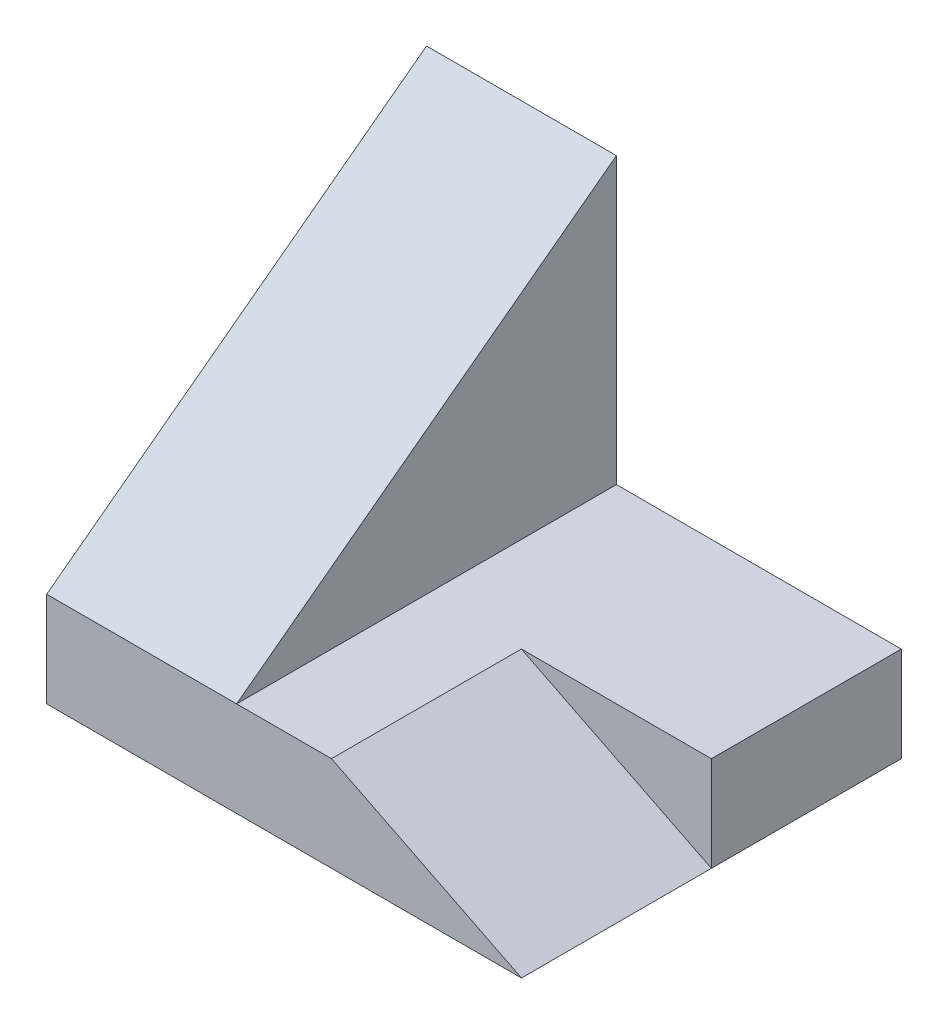
ISO-10303-21;
HEADER;
FILE_DESCRIPTION(('STEP AP214'),'2;1');
FILE_NAME('part.step','',(''),(''),'','','');
FILE_SCHEMA(('AUTOMOTIVE_DESIGN { 1 0 10303 214 1 1 1 1 }'));
ENDSEC;
DATA;
#1=APPLICATION_CONTEXT('core data for automotive mechanical design processes');
#2=APPLICATION_PROTOCOL_DEFINITION('international standard','automotive_design',2000,#1);
#3=PRODUCT_CONTEXT('',#1,'mechanical');
#4=PRODUCT('Part','Part','',(#3));
#5=PRODUCT_RELATED_PRODUCT_CATEGORY('part','',(#4));
#6=PRODUCT_DEFINITION_FORMATION('','',#4);
#7=PRODUCT_DEFINITION_CONTEXT('part definition',#1,'design');
#8=PRODUCT_DEFINITION('design','',#6,#7);
#9=PRODUCT_DEFINITION_SHAPE('','',#8);
#10=(LENGTH_UNIT() NAMED_UNIT(*) SI_UNIT(.MILLI.,.METRE.));
#11=(NAMED_UNIT(*) PLANE_ANGLE_UNIT() SI_UNIT($,.RADIAN.));
#12=(NAMED_UNIT(*) SI_UNIT($,.STERADIAN.) SOLID_ANGLE_UNIT());
#13=UNCERTAINTY_MEASURE_WITH_UNIT(LENGTH_MEASURE(1.E-05),#10,'distance_accuracy_value','');
#14=(GEOMETRIC_REPRESENTATION_CONTEXT(3) GLOBAL_UNCERTAINTY_ASSIGNED_CONTEXT((#13)) GLOBAL_UNIT_ASSIGNED_CONTEXT((#10,
#11,#12)) REPRESENTATION_CONTEXT('',''));
#15=CARTESIAN_POINT('',(0.,0.,0.));
#16=DIRECTION('',(0.,0.,1.));
#17=DIRECTION('',(1.,0.,0.));
#18=AXIS2_PLACEMENT_3D('',#15,#16,#17);
#19=CARTESIAN_POINT('',(0.,9.99999999999991,0.));
#20=DIRECTION('',(0.,-1.,0.));
#21=DIRECTION('',(0.,0.,-1.));
#22=AXIS2_PLACEMENT_3D('',#19,#20,#21);
#23=PLANE('',#22);
#24=DIRECTION('',(0.,0.,-1.));
#25=VECTOR('',#24,1.);
#26=CARTESIAN_POINT('',(20.0003346422784,9.99999999999991,0.));
#27=LINE('',#26,#25);
#28=CARTESIAN_POINT('',(20.0003346422784,9.99999999999991,0.));
#29=VERTEX_POINT('',#28);
#30=CARTESIAN_POINT('',(20.0003346422784,9.99999999999991,-40.));
#31=VERTEX_POINT('',#30);
#32=EDGE_CURVE('E145',#29,#31,#27,.T.);
#33=ORIENTED_EDGE('',*,*,#32,.F.);
#34=DIRECTION('',(1.,0.,0.));
#35=VECTOR('',#34,1.);
#36=CARTESIAN_POINT('',(0.,9.99999999999991,0.));
#37=LINE('',#36,#35);
#38=CARTESIAN_POINT('',(29.992004992005,9.99999999999991,0.));
#39=VERTEX_POINT('',#38);
#40=EDGE_CURVE('E97',#29,#39,#37,.T.);
#41=ORIENTED_EDGE('',*,*,#40,.T.);
#42=DIRECTION('',(0.,0.,1.));
#43=VECTOR('',#42,1.);
#44=CARTESIAN_POINT('',(29.992004992005,9.99999999999991,-19.9999999999999));
#45=LINE('',#44,#43);
#46=CARTESIAN_POINT('',(29.992004992005,9.99999999999991,-19.9999999999999));
#47=VERTEX_POINT('',#46);
#48=EDGE_CURVE('E112',#47,#39,#45,.T.);
#49=ORIENTED_EDGE('',*,*,#48,.F.);
#50=DIRECTION('',(-1.,0.,0.));
#51=VECTOR('',#50,1.);
#52=CARTESIAN_POINT('',(50.,9.99999999999991,-19.9999999999999));
#53=LINE('',#52,#51);
#54=CARTESIAN_POINT('',(50.,9.99999999999991,-19.9999999999999));
#55=VERTEX_POINT('',#54);
#56=EDGE_CURVE('E133',#55,#47,#53,.T.);
#57=ORIENTED_EDGE('',*,*,#56,.F.);
#58=DIRECTION('',(0.,0.,-1.));
#59=VECTOR('',#58,1.);
#60=CARTESIAN_POINT('',(50.,9.99999999999991,0.));
#61=LINE('',#60,#59);
#62=CARTESIAN_POINT('',(50.,9.99999999999991,-40.));
#63=VERTEX_POINT('',#62);
#64=EDGE_CURVE('E55',#55,#63,#61,.T.);
#65=ORIENTED_EDGE('',*,*,#64,.T.);
#66=DIRECTION('',(-1.,0.,0.));
#67=VECTOR('',#66,1.);
#68=CARTESIAN_POINT('',(0.,9.99999999999991,-40.));
#69=LINE('',#68,#67);
#70=EDGE_CURVE('E90',#63,#31,#69,.T.);
#71=ORIENTED_EDGE('',*,*,#70,.T.);
#72=EDGE_LOOP('',(#33,#41,#49,#57,#65,#71));
#73=FACE_BOUND('',#72,.T.);
#74=ADVANCED_FACE('F39',(#73),#23,.F.);
#75=CARTESIAN_POINT('',(50.,9.99999999999991,0.));
#76=DIRECTION('',(-1.,0.,0.));
#77=DIRECTION('',(0.,0.,1.));
#78=AXIS2_PLACEMENT_3D('',#75,#76,#77);
#79=PLANE('',#78);
#80=DIRECTION('',(0.,1.,0.));
#81=VECTOR('',#80,1.);
#82=CARTESIAN_POINT('',(50.,0.,-19.9999999999999));
#83=LINE('',#82,#81);
#84=CARTESIAN_POINT('',(50.,0.,-19.9999999999999));
#85=VERTEX_POINT('',#84);
#86=EDGE_CURVE('E77',#85,#55,#83,.T.);
#87=ORIENTED_EDGE('',*,*,#86,.F.);
#88=DIRECTION('',(0.,0.,-1.));
#89=VECTOR('',#88,1.);
#90=CARTESIAN_POINT('',(50.,0.,0.));
#91=LINE('',#90,#89);
#92=CARTESIAN_POINT('',(50.,0.,-40.));
#93=VERTEX_POINT('',#92);
#94=EDGE_CURVE('E72',#85,#93,#91,.T.);
#95=ORIENTED_EDGE('',*,*,#94,.T.);
#96=DIRECTION('',(0.,-1.,0.));
#97=VECTOR('',#96,1.);
#98=CARTESIAN_POINT('',(50.,9.99999999999991,-40.));
#99=LINE('',#98,#97);
#100=EDGE_CURVE('E48',#63,#93,#99,.T.);
#101=ORIENTED_EDGE('',*,*,#100,.F.);
#102=ORIENTED_EDGE('',*,*,#64,.F.);
#103=EDGE_LOOP('',(#87,#95,#101,#102));
#104=FACE_BOUND('',#103,.T.);
#105=ADVANCED_FACE('F74',(#104),#79,.F.);
#106=CARTESIAN_POINT('',(0.,9.99999999999991,0.));
#107=DIRECTION('',(1.,0.,0.));
#108=DIRECTION('',(0.,0.,-1.));
#109=AXIS2_PLACEMENT_3D('',#106,#107,#108);
#110=PLANE('',#109);
#111=DIRECTION('',(0.,-1.,0.));
#112=VECTOR('',#111,1.);
#113=CARTESIAN_POINT('',(0.,9.99999999999991,0.));
#114=LINE('',#113,#112);
#115=CARTESIAN_POINT('',(0.,9.99999999999991,0.));
#116=VERTEX_POINT('',#115);
#117=CARTESIAN_POINT('',(0.,0.,0.));
#118=VERTEX_POINT('',#117);
#119=EDGE_CURVE('E11',#116,#118,#114,.T.);
#120=ORIENTED_EDGE('',*,*,#119,.F.);
#121=DIRECTION('',(0.,0.599999999999999,-0.800000000000001));
#122=VECTOR('',#121,1.);
#123=CARTESIAN_POINT('',(0.,9.99999999999991,0.));
#124=LINE('',#123,#122);
#125=CARTESIAN_POINT('',(0.,39.9999999999998,-40.));
#126=VERTEX_POINT('',#125);
#127=EDGE_CURVE('E148',#116,#126,#124,.T.);
#128=ORIENTED_EDGE('',*,*,#127,.T.);
#129=DIRECTION('',(0.,-1.,0.));
#130=VECTOR('',#129,1.);
#131=CARTESIAN_POINT('',(0.,9.99999999999991,-40.));
#132=LINE('',#131,#130);
#133=CARTESIAN_POINT('',(0.,0.,-40.));
#134=VERTEX_POINT('',#133);
#135=EDGE_CURVE('E91',#126,#134,#132,.T.);
#136=ORIENTED_EDGE('',*,*,#135,.T.);
#137=DIRECTION('',(0.,0.,1.));
#138=VECTOR('',#137,1.);
#139=CARTESIAN_POINT('',(0.,0.,0.));
#140=LINE('',#139,#138);
#141=EDGE_CURVE('E96',#134,#118,#140,.T.);
#142=ORIENTED_EDGE('',*,*,#141,.T.);
#143=EDGE_LOOP('',(#120,#128,#136,#142));
#144=FACE_BOUND('',#143,.T.);
#145=ADVANCED_FACE('F41',(#144),#110,.F.);
#146=CARTESIAN_POINT('',(0.,9.99999999999991,0.));
#147=DIRECTION('',(0.,0.,-1.));
#148=DIRECTION('',(-1.,0.,0.));
#149=AXIS2_PLACEMENT_3D('',#146,#147,#148);
#150=PLANE('',#149);
#151=ORIENTED_EDGE('',*,*,#40,.F.);
#152=DIRECTION('',(1.,0.,0.));
#153=VECTOR('',#152,1.);
#154=CARTESIAN_POINT('',(-0.999665357721558,9.99999999999991,0.));
#155=LINE('',#154,#153);
#156=EDGE_CURVE('E151',#116,#29,#155,.T.);
#157=ORIENTED_EDGE('',*,*,#156,.F.);
#158=ORIENTED_EDGE('',*,*,#119,.T.);
#159=DIRECTION('',(1.,0.,0.));
#160=VECTOR('',#159,1.);
#161=CARTESIAN_POINT('',(0.,0.,0.));
#162=LINE('',#161,#160);
#163=CARTESIAN_POINT('',(50.,0.,0.));
#164=VERTEX_POINT('',#163);
#165=EDGE_CURVE('E82',#118,#164,#162,.T.);
#166=ORIENTED_EDGE('',*,*,#165,.T.);
#167=DIRECTION('',(0.894498666235902,-0.4470706164603,0.));
#168=VECTOR('',#167,1.);
#169=CARTESIAN_POINT('',(29.992004992005,9.99999999999991,0.));
#170=LINE('',#169,#168);
#171=EDGE_CURVE('E118',#39,#164,#170,.T.);
#172=ORIENTED_EDGE('',*,*,#171,.F.);
#173=EDGE_LOOP('',(#151,#157,#158,#166,#172));
#174=FACE_BOUND('',#173,.T.);
#175=ADVANCED_FACE('F117',(#174),#150,.F.);
#176=CARTESIAN_POINT('',(0.,9.99999999999991,-40.));
#177=DIRECTION('',(0.,0.,1.));
#178=DIRECTION('',(1.,0.,0.));
#179=AXIS2_PLACEMENT_3D('',#176,#177,#178);
#180=PLANE('',#179);
#181=DIRECTION('',(-1.,0.,0.));
#182=VECTOR('',#181,1.);
#183=CARTESIAN_POINT('',(0.,0.,-40.));
#184=LINE('',#183,#182);
#185=EDGE_CURVE('E87',#93,#134,#184,.T.);
#186=ORIENTED_EDGE('',*,*,#185,.T.);
#187=ORIENTED_EDGE('',*,*,#135,.F.);
#188=DIRECTION('',(-1.,0.,0.));
#189=VECTOR('',#188,1.);
#190=CARTESIAN_POINT('',(0.,39.9999999999998,-40.));
#191=LINE('',#190,#189);
#192=CARTESIAN_POINT('',(20.0003346422784,39.9999999999998,-40.));
#193=VERTEX_POINT('',#192);
#194=EDGE_CURVE('E140',#193,#126,#191,.T.);
#195=ORIENTED_EDGE('',*,*,#194,.F.);
#196=DIRECTION('',(0.,-1.,0.));
#197=VECTOR('',#196,1.);
#198=CARTESIAN_POINT('',(20.0003346422784,39.9999999999998,-40.));
#199=LINE('',#198,#197);
#200=EDGE_CURVE('E139',#193,#31,#199,.T.);
#201=ORIENTED_EDGE('',*,*,#200,.T.);
#202=ORIENTED_EDGE('',*,*,#70,.F.);
#203=ORIENTED_EDGE('',*,*,#100,.T.);
#204=EDGE_LOOP('',(#186,#187,#195,#201,#202,#203));
#205=FACE_BOUND('',#204,.T.);
#206=ADVANCED_FACE('F85',(#205),#180,.F.);
#207=CARTESIAN_POINT('',(0.,0.,0.));
#208=DIRECTION('',(0.,-1.,0.));
#209=DIRECTION('',(0.,0.,-1.));
#210=AXIS2_PLACEMENT_3D('',#207,#208,#209);
#211=PLANE('',#210);
#212=ORIENTED_EDGE('',*,*,#141,.F.);
#213=ORIENTED_EDGE('',*,*,#185,.F.);
#214=ORIENTED_EDGE('',*,*,#94,.F.);
#215=EDGE_CURVE('E81',#164,#85,#91,.T.);
#216=ORIENTED_EDGE('',*,*,#215,.F.);
#217=ORIENTED_EDGE('',*,*,#165,.F.);
#218=EDGE_LOOP('',(#212,#213,#214,#216,#217));
#219=FACE_BOUND('',#218,.T.);
#220=ADVANCED_FACE('F93',(#219),#211,.T.);
#221=CARTESIAN_POINT('',(29.992004992005,9.99999999999991,-19.9999999999999));
#222=DIRECTION('',(-0.4470706164603,-0.894498666235902,0.));
#223=DIRECTION('',(0.894498666235902,-0.4470706164603,0.));
#224=AXIS2_PLACEMENT_3D('',#221,#222,#223);
#225=PLANE('',#224);
#226=ORIENTED_EDGE('',*,*,#171,.T.);
#227=ORIENTED_EDGE('',*,*,#215,.T.);
#228=DIRECTION('',(0.894498666235902,-0.4470706164603,0.));
#229=VECTOR('',#228,1.);
#230=CARTESIAN_POINT('',(29.992004992005,9.99999999999991,-19.9999999999999));
#231=LINE('',#230,#229);
#232=EDGE_CURVE('E127',#47,#85,#231,.T.);
#233=ORIENTED_EDGE('',*,*,#232,.F.);
#234=ORIENTED_EDGE('',*,*,#48,.T.);
#235=EDGE_LOOP('',(#226,#227,#233,#234));
#236=FACE_BOUND('',#235,.T.);
#237=ADVANCED_FACE('F124',(#236),#225,.F.);
#238=CARTESIAN_POINT('',(0.,0.,-19.9999999999999));
#239=DIRECTION('',(0.,0.,1.));
#240=DIRECTION('',(1.,0.,0.));
#241=AXIS2_PLACEMENT_3D('',#238,#239,#240);
#242=PLANE('',#241);
#243=ORIENTED_EDGE('',*,*,#86,.T.);
#244=ORIENTED_EDGE('',*,*,#56,.T.);
#245=ORIENTED_EDGE('',*,*,#232,.T.);
#246=EDGE_LOOP('',(#243,#244,#245));
#247=FACE_BOUND('',#246,.T.);
#248=ADVANCED_FACE('F131',(#247),#242,.T.);
#249=CARTESIAN_POINT('',(20.0003346422784,39.9999999999998,0.));
#250=DIRECTION('',(-1.,0.,0.));
#251=DIRECTION('',(0.,0.,1.));
#252=AXIS2_PLACEMENT_3D('',#249,#250,#251);
#253=PLANE('',#252);
#254=ORIENTED_EDGE('',*,*,#200,.F.);
#255=DIRECTION('',(0.,0.599999999999999,-0.800000000000001));
#256=VECTOR('',#255,1.);
#257=CARTESIAN_POINT('',(20.0003346422784,9.99999999999991,0.));
#258=LINE('',#257,#256);
#259=EDGE_CURVE('E154',#29,#193,#258,.T.);
#260=ORIENTED_EDGE('',*,*,#259,.F.);
#261=ORIENTED_EDGE('',*,*,#32,.T.);
#262=EDGE_LOOP('',(#254,#260,#261));
#263=FACE_BOUND('',#262,.T.);
#264=ADVANCED_FACE('F165',(#263),#253,.F.);
#265=CARTESIAN_POINT('',(-0.999665357721558,9.99999999999991,0.));
#266=DIRECTION('',(0.,-0.800000000000001,-0.599999999999999));
#267=DIRECTION('',(0.,0.599999999999999,-0.800000000000001));
#268=AXIS2_PLACEMENT_3D('',#265,#266,#267);
#269=PLANE('',#268);
#270=ORIENTED_EDGE('',*,*,#156,.T.);
#271=ORIENTED_EDGE('',*,*,#259,.T.);
#272=ORIENTED_EDGE('',*,*,#194,.T.);
#273=ORIENTED_EDGE('',*,*,#127,.F.);
#274=EDGE_LOOP('',(#270,#271,#272,#273));
#275=FACE_BOUND('',#274,.T.);
#276=ADVANCED_FACE('F159',(#275),#269,.F.);
#277=CLOSED_SHELL('',(#74,#105,#145,#175,#206,#220,#237,#248,#264,#276));
#278=MANIFOLD_SOLID_BREP('B2',#277);
#279=ADVANCED_BREP_SHAPE_REPRESENTATION('',(#18,#278),#14);
#280=SHAPE_DEFINITION_REPRESENTATION(#9,#279);
ENDSEC;
END-ISO-10303-21;
